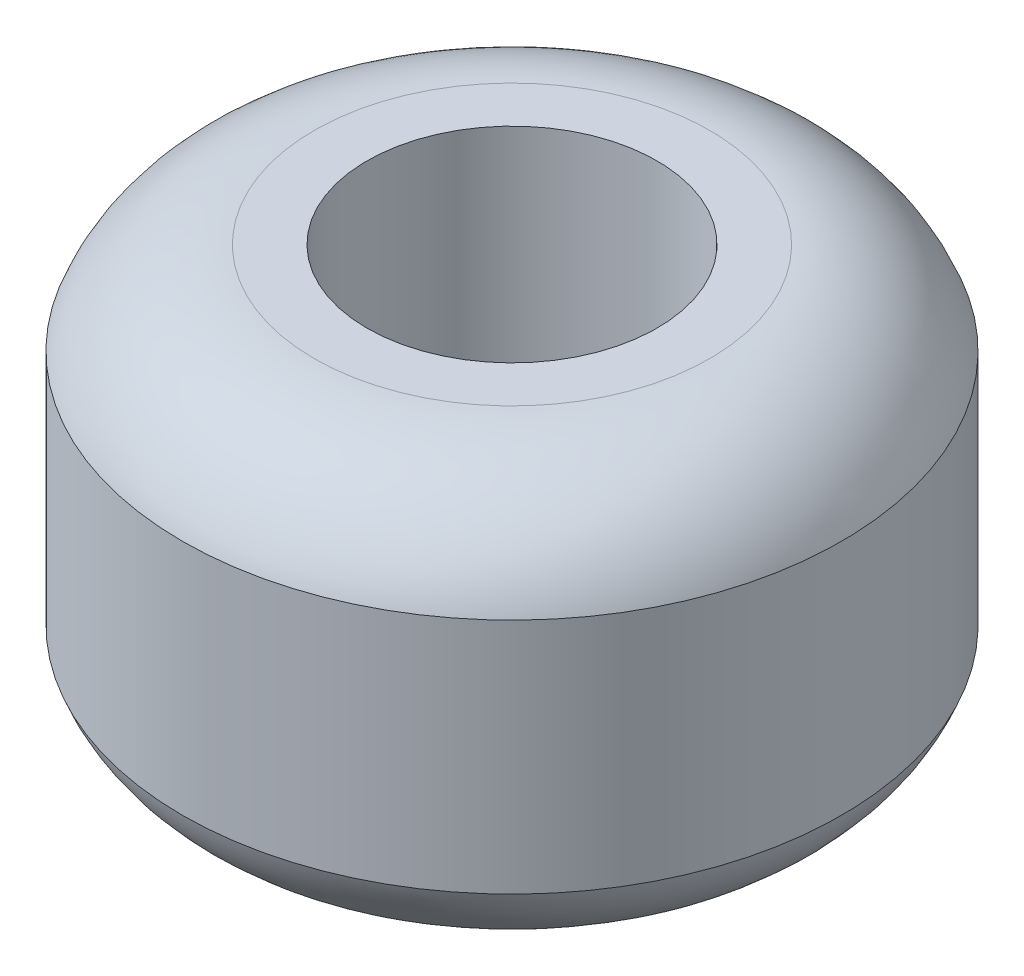
ISO-10303-21;
HEADER;
FILE_DESCRIPTION(('STEP AP214'),'2;1');
FILE_NAME('part.step','',(''),(''),'','','');
FILE_SCHEMA(('AUTOMOTIVE_DESIGN { 1 0 10303 214 1 1 1 1 }'));
ENDSEC;
DATA;
#1=APPLICATION_CONTEXT('core data for automotive mechanical design processes');
#2=APPLICATION_PROTOCOL_DEFINITION('international standard','automotive_design',2000,#1);
#3=PRODUCT_CONTEXT('',#1,'mechanical');
#4=PRODUCT('Part','Part','',(#3));
#5=PRODUCT_RELATED_PRODUCT_CATEGORY('part','',(#4));
#6=PRODUCT_DEFINITION_FORMATION('','',#4);
#7=PRODUCT_DEFINITION_CONTEXT('part definition',#1,'design');
#8=PRODUCT_DEFINITION('design','',#6,#7);
#9=PRODUCT_DEFINITION_SHAPE('','',#8);
#10=(LENGTH_UNIT() NAMED_UNIT(*) SI_UNIT(.MILLI.,.METRE.));
#11=(NAMED_UNIT(*) PLANE_ANGLE_UNIT() SI_UNIT($,.RADIAN.));
#12=(NAMED_UNIT(*) SI_UNIT($,.STERADIAN.) SOLID_ANGLE_UNIT());
#13=UNCERTAINTY_MEASURE_WITH_UNIT(LENGTH_MEASURE(1.E-05),#10,'distance_accuracy_value','');
#14=(GEOMETRIC_REPRESENTATION_CONTEXT(3) GLOBAL_UNCERTAINTY_ASSIGNED_CONTEXT((#13)) GLOBAL_UNIT_ASSIGNED_CONTEXT((#10,
#11,#12)) REPRESENTATION_CONTEXT('',''));
#15=CARTESIAN_POINT('',(0.,0.,0.));
#16=DIRECTION('',(0.,0.,1.));
#17=DIRECTION('',(1.,0.,0.));
#18=AXIS2_PLACEMENT_3D('',#15,#16,#17);
#19=CARTESIAN_POINT('',(11.,-16.,0.));
#20=DIRECTION('',(0.,1.,0.));
#21=DIRECTION('',(0.,0.,1.));
#22=AXIS2_PLACEMENT_3D('',#19,#20,#21);
#23=PLANE('',#22);
#24=CARTESIAN_POINT('',(0.,-16.,0.));
#25=DIRECTION('',(0.,1.,0.));
#26=DIRECTION('',(0.,0.,1.));
#27=AXIS2_PLACEMENT_3D('',#24,#25,#26);
#28=CIRCLE('',#27,15.);
#29=CARTESIAN_POINT('',(0.,-16.,15.));
#30=VERTEX_POINT('',#29);
#31=EDGE_CURVE('E10',#30,#30,#28,.T.);
#32=ORIENTED_EDGE('',*,*,#31,.F.);
#33=EDGE_LOOP('',(#32));
#34=FACE_BOUND('',#33,.T.);
#35=CARTESIAN_POINT('',(0.,-16.,0.));
#36=DIRECTION('',(0.,1.,0.));
#37=DIRECTION('',(0.,0.,1.));
#38=AXIS2_PLACEMENT_3D('',#35,#36,#37);
#39=CIRCLE('',#38,11.);
#40=CARTESIAN_POINT('',(0.,-16.,11.));
#41=VERTEX_POINT('',#40);
#42=EDGE_CURVE('E53',#41,#41,#39,.T.);
#43=ORIENTED_EDGE('',*,*,#42,.T.);
#44=EDGE_LOOP('',(#43));
#45=FACE_BOUND('',#44,.T.);
#46=ADVANCED_FACE('F31',(#34,#45),#23,.F.);
#47=CARTESIAN_POINT('',(0.,-5.35714285714285,0.));
#48=DIRECTION('',(0.,1.,0.));
#49=DIRECTION('',(0.,0.,1.));
#50=AXIS2_PLACEMENT_3D('',#47,#48,#49);
#51=TOROIDAL_SURFACE('',#50,15.,10.6428571428571);
#52=CARTESIAN_POINT('',(0.,-9.,0.));
#53=DIRECTION('',(0.,1.,0.));
#54=DIRECTION('',(0.,0.,1.));
#55=AXIS2_PLACEMENT_3D('',#52,#53,#54);
#56=CIRCLE('',#55,25.);
#57=CARTESIAN_POINT('',(0.,-9.,25.));
#58=VERTEX_POINT('',#57);
#59=EDGE_CURVE('E37',#58,#58,#56,.T.);
#60=ORIENTED_EDGE('',*,*,#59,.F.);
#61=EDGE_LOOP('',(#60));
#62=FACE_BOUND('',#61,.T.);
#63=ORIENTED_EDGE('',*,*,#31,.T.);
#64=EDGE_LOOP('',(#63));
#65=FACE_BOUND('',#64,.T.);
#66=ADVANCED_FACE('F78',(#62,#65),#51,.T.);
#67=CARTESIAN_POINT('',(0.,26.1418940609952,0.));
#68=DIRECTION('',(0.,1.,0.));
#69=DIRECTION('',(0.,0.,1.));
#70=AXIS2_PLACEMENT_3D('',#67,#68,#69);
#71=CYLINDRICAL_SURFACE('',#70,25.);
#72=CARTESIAN_POINT('',(0.,9.,0.));
#73=DIRECTION('',(0.,1.,0.));
#74=DIRECTION('',(0.,0.,1.));
#75=AXIS2_PLACEMENT_3D('',#72,#73,#74);
#76=CIRCLE('',#75,25.);
#77=CARTESIAN_POINT('',(0.,9.,25.));
#78=VERTEX_POINT('',#77);
#79=EDGE_CURVE('E41',#78,#78,#76,.T.);
#80=ORIENTED_EDGE('',*,*,#79,.F.);
#81=EDGE_LOOP('',(#80));
#82=FACE_BOUND('',#81,.T.);
#83=ORIENTED_EDGE('',*,*,#59,.T.);
#84=EDGE_LOOP('',(#83));
#85=FACE_BOUND('',#84,.T.);
#86=ADVANCED_FACE('F73',(#82,#85),#71,.T.);
#87=CARTESIAN_POINT('',(0.,5.35714285714285,0.));
#88=DIRECTION('',(0.,1.,0.));
#89=DIRECTION('',(0.,0.,1.));
#90=AXIS2_PLACEMENT_3D('',#87,#88,#89);
#91=TOROIDAL_SURFACE('',#90,15.,10.6428571428571);
#92=CARTESIAN_POINT('',(0.,16.,0.));
#93=DIRECTION('',(0.,1.,0.));
#94=DIRECTION('',(0.,0.,1.));
#95=AXIS2_PLACEMENT_3D('',#92,#93,#94);
#96=CIRCLE('',#95,15.);
#97=CARTESIAN_POINT('',(0.,16.,15.));
#98=VERTEX_POINT('',#97);
#99=EDGE_CURVE('E45',#98,#98,#96,.T.);
#100=ORIENTED_EDGE('',*,*,#99,.F.);
#101=EDGE_LOOP('',(#100));
#102=FACE_BOUND('',#101,.T.);
#103=ORIENTED_EDGE('',*,*,#79,.T.);
#104=EDGE_LOOP('',(#103));
#105=FACE_BOUND('',#104,.T.);
#106=ADVANCED_FACE('F67',(#102,#105),#91,.T.);
#107=CARTESIAN_POINT('',(11.,16.,0.));
#108=DIRECTION('',(0.,-1.,0.));
#109=DIRECTION('',(0.,0.,-1.));
#110=AXIS2_PLACEMENT_3D('',#107,#108,#109);
#111=PLANE('',#110);
#112=CARTESIAN_POINT('',(0.,16.,0.));
#113=DIRECTION('',(0.,1.,0.));
#114=DIRECTION('',(0.,0.,1.));
#115=AXIS2_PLACEMENT_3D('',#112,#113,#114);
#116=CIRCLE('',#115,11.);
#117=CARTESIAN_POINT('',(0.,16.,11.));
#118=VERTEX_POINT('',#117);
#119=EDGE_CURVE('E50',#118,#118,#116,.T.);
#120=ORIENTED_EDGE('',*,*,#119,.F.);
#121=EDGE_LOOP('',(#120));
#122=FACE_BOUND('',#121,.T.);
#123=ORIENTED_EDGE('',*,*,#99,.T.);
#124=EDGE_LOOP('',(#123));
#125=FACE_BOUND('',#124,.T.);
#126=ADVANCED_FACE('F61',(#122,#125),#111,.F.);
#127=CARTESIAN_POINT('',(0.,26.1418940609952,0.));
#128=DIRECTION('',(0.,1.,0.));
#129=DIRECTION('',(0.,0.,1.));
#130=AXIS2_PLACEMENT_3D('',#127,#128,#129);
#131=CYLINDRICAL_SURFACE('',#130,11.);
#132=ORIENTED_EDGE('',*,*,#42,.F.);
#133=EDGE_LOOP('',(#132));
#134=FACE_BOUND('',#133,.T.);
#135=ORIENTED_EDGE('',*,*,#119,.T.);
#136=EDGE_LOOP('',(#135));
#137=FACE_BOUND('',#136,.T.);
#138=ADVANCED_FACE('F58',(#134,#137),#131,.F.);
#139=CLOSED_SHELL('',(#46,#66,#86,#106,#126,#138));
#140=MANIFOLD_SOLID_BREP('B2',#139);
#141=ADVANCED_BREP_SHAPE_REPRESENTATION('',(#18,#140),#14);
#142=SHAPE_DEFINITION_REPRESENTATION(#9,#141);
ENDSEC;
END-ISO-10303-21;
